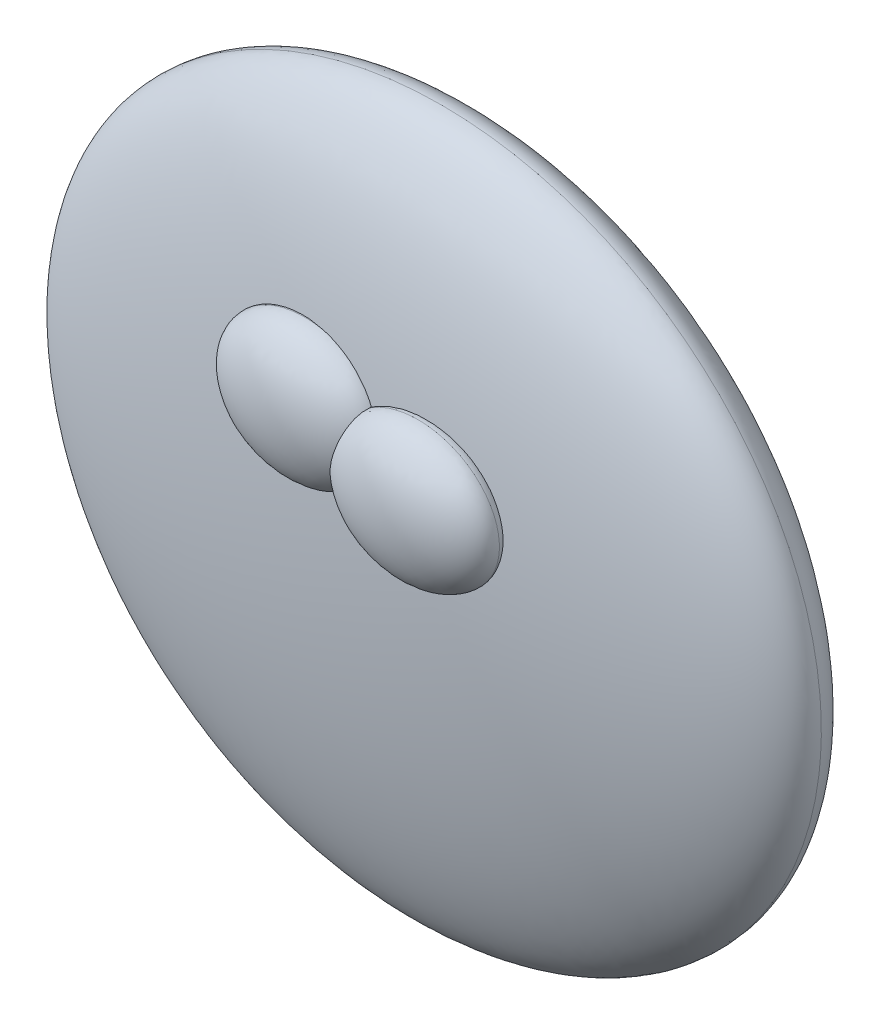
ISO-10303-21;
HEADER;
FILE_DESCRIPTION(('STEP AP214'),'2;1');
FILE_NAME('part.step','',(''),(''),'','','');
FILE_SCHEMA(('AUTOMOTIVE_DESIGN { 1 0 10303 214 1 1 1 1 }'));
ENDSEC;
DATA;
#1=APPLICATION_CONTEXT('core data for automotive mechanical design processes');
#2=APPLICATION_PROTOCOL_DEFINITION('international standard','automotive_design',2000,#1);
#3=PRODUCT_CONTEXT('',#1,'mechanical');
#4=PRODUCT('Part','Part','',(#3));
#5=PRODUCT_RELATED_PRODUCT_CATEGORY('part','',(#4));
#6=PRODUCT_DEFINITION_FORMATION('','',#4);
#7=PRODUCT_DEFINITION_CONTEXT('part definition',#1,'design');
#8=PRODUCT_DEFINITION('design','',#6,#7);
#9=PRODUCT_DEFINITION_SHAPE('','',#8);
#10=(LENGTH_UNIT() NAMED_UNIT(*) SI_UNIT(.MILLI.,.METRE.));
#11=(NAMED_UNIT(*) PLANE_ANGLE_UNIT() SI_UNIT($,.RADIAN.));
#12=(NAMED_UNIT(*) SI_UNIT($,.STERADIAN.) SOLID_ANGLE_UNIT());
#13=UNCERTAINTY_MEASURE_WITH_UNIT(LENGTH_MEASURE(1.E-05),#10,'distance_accuracy_value','');
#14=(GEOMETRIC_REPRESENTATION_CONTEXT(3) GLOBAL_UNCERTAINTY_ASSIGNED_CONTEXT((#13)) GLOBAL_UNIT_ASSIGNED_CONTEXT((#10,
#11,#12)) REPRESENTATION_CONTEXT('',''));
#15=CARTESIAN_POINT('',(0.,0.,0.));
#16=DIRECTION('',(0.,0.,1.));
#17=DIRECTION('',(1.,0.,0.));
#18=AXIS2_PLACEMENT_3D('',#15,#16,#17);
#19=CARTESIAN_POINT('',(-0.182486812125,0.03085283473532,0.11764602781));
#20=CARTESIAN_POINT('',(-0.183182416261,0.01588381094367,0.117734641001));
#21=CARTESIAN_POINT('',(-0.200799941815,0.0167024677759,0.117730916362));
#22=CARTESIAN_POINT('',(-0.218417467369,0.01752112460814,0.117727191723));
#23=CARTESIAN_POINT('',(-0.217721863233,0.03249014839979,0.117638578532));
#24=CARTESIAN_POINT('',(-0.182486812125,0.03085283473532,0.11764602781));
#25=CARTESIAN_POINT('',(-0.183181880746,0.01593368741118,0.126164249849));
#26=CARTESIAN_POINT('',(-0.2007994063,0.01675234424341,0.12616052521));
#27=CARTESIAN_POINT('',(-0.218416931854,0.01757100107564,0.126156800572));
#28=CARTESIAN_POINT('',(-0.217721863233,0.03249014839979,0.117638578532));
#29=CARTESIAN_POINT('',(-0.182486812125,0.03085283473532,0.11764602781));
#30=CARTESIAN_POINT('',(-0.182486276609,0.03090271120283,0.126075636659));
#31=CARTESIAN_POINT('',(-0.200103802163,0.03172136803506,0.12607191202));
#32=CARTESIAN_POINT('',(-0.217721327717,0.03254002486729,0.126068187381));
#33=CARTESIAN_POINT('',(-0.217721863233,0.03249014839979,0.117638578532));
#34=CARTESIAN_POINT('',(-0.182486812125,0.03085283473532,0.11764602781));
#35=CARTESIAN_POINT('',(-0.181790672473,0.04587173499448,0.125987023468));
#36=CARTESIAN_POINT('',(-0.199408198027,0.04669039182671,0.125983298829));
#37=CARTESIAN_POINT('',(-0.217025723581,0.04750904865895,0.12597957419));
#38=CARTESIAN_POINT('',(-0.217721863233,0.03249014839979,0.117638578532));
#39=CARTESIAN_POINT('',(-0.182486812125,0.03085283473532,0.11764602781));
#40=CARTESIAN_POINT('',(-0.181791207988,0.04582185852697,0.117557414619));
#41=CARTESIAN_POINT('',(-0.199408733542,0.0466405153592,0.117553689981));
#42=CARTESIAN_POINT('',(-0.217026259096,0.04745917219144,0.117549965342));
#43=CARTESIAN_POINT('',(-0.217721863233,0.03249014839979,0.117638578532));
#44=(BOUNDED_SURFACE() B_SPLINE_SURFACE(2,2,((#19,#20,#21,#22,#23),(#24,#25,#26,#27,#28),(#29,
#30,#31,#32,#33),(#34,#35,#36,#37,#38),(#39,#40,#41,#42,#43)),.UNSPECIFIED.,.F.,.F.,
.F.) B_SPLINE_SURFACE_WITH_KNOTS((3,2,3),(3,2,3),(0.,1.570796326795,3.14159265359),
(-1.570796326795,0.,1.570796326795),
.UNSPECIFIED.) GEOMETRIC_REPRESENTATION_ITEM() RATIONAL_B_SPLINE_SURFACE(((1.,0.707106781187,1.,
0.707106781187,1.),(0.707106781187,0.5,0.707106781187,0.5,0.707106781187),(1.,0.707106781187,1.,
0.707106781187,1.),(0.707106781187,0.5,0.707106781187,0.5,0.707106781187),(1.,0.707106781187,1.,
0.707106781187,1.))) REPRESENTATION_ITEM('') SURFACE());
#45=CARTESIAN_POINT('',(-0.182486812125,0.03085283473532,0.11764602781));
#46=CARTESIAN_POINT('',(-0.181791207988,0.04582185852697,0.117557414619));
#47=CARTESIAN_POINT('',(-0.199408733542,0.0466405153592,0.117553689981));
#48=CARTESIAN_POINT('',(-0.217026259096,0.04745917219144,0.117549965342));
#49=CARTESIAN_POINT('',(-0.217721863233,0.03249014839979,0.117638578532));
#50=(BOUNDED_CURVE() B_SPLINE_CURVE(2,(#45,#46,#47,#48,#49),.UNSPECIFIED.,.F.,
.F.) B_SPLINE_CURVE_WITH_KNOTS((3,2,3),(-1.570796326795,0.,1.570796326795),
.UNSPECIFIED.) CURVE() GEOMETRIC_REPRESENTATION_ITEM() RATIONAL_B_SPLINE_CURVE((1.,
0.707106781187,1.,0.707106781187,1.)) REPRESENTATION_ITEM(''));
#51=CARTESIAN_POINT('',(-0.182486812125,0.03085283473532,0.11764602781));
#52=VERTEX_POINT('',#51);
#53=CARTESIAN_POINT('',(-0.217721863233,0.03249014839979,0.117638578532));
#54=VERTEX_POINT('',#53);
#55=EDGE_CURVE('P0_E20',#52,#54,#50,.T.);
#56=CARTESIAN_POINT('',(-0.182486812125,0.03085283473532,0.11764602781));
#57=CARTESIAN_POINT('',(-0.183182416260353,0.0158838110038796,0.117734651175173));
#58=CARTESIAN_POINT('',(-0.200799941814353,0.0167024678361096,0.117730926536173));
#59=CARTESIAN_POINT('',(-0.218417467368353,0.0175211246683496,0.117727201897173));
#60=CARTESIAN_POINT('',(-0.217721863233,0.03249014839979,0.117638578532));
#61=(BOUNDED_CURVE() B_SPLINE_CURVE(2,(#56,#57,#58,#59,#60),.UNSPECIFIED.,.F.,
.F.) B_SPLINE_CURVE_WITH_KNOTS((3,2,3),(-1.570796326795,0.,1.570796326795),
.UNSPECIFIED.) CURVE() GEOMETRIC_REPRESENTATION_ITEM() RATIONAL_B_SPLINE_CURVE((0.999999500062691,
0.707106427677939,0.999999500062691,0.707106427677939,0.999999500062691)) REPRESENTATION_ITEM(''));
#62=EDGE_CURVE('P0_E11',#54,#52,#61,.F.);
#63=ORIENTED_EDGE('',*,*,#55,.T.);
#64=ORIENTED_EDGE('',*,*,#62,.T.);
#65=EDGE_LOOP('',(#63,#64));
#66=FACE_BOUND('',#65,.T.);
#67=ADVANCED_FACE('P0_F17',(#66),#44,.T.);
#68=OPEN_SHELL('',(#67));
#69=SHELL_BASED_SURFACE_MODEL('P0_B1',(#68));
#70=CARTESIAN_POINT('',(-0.298258749852,0.01326748589959,0.09838185279975));
#71=CARTESIAN_POINT('',(-0.297432878373,0.09018688834261,0.09792668217288));
#72=CARTESIAN_POINT('',(-0.213918922302,0.08929021218269,0.09792668217288));
#73=CARTESIAN_POINT('',(-0.130404966232,0.08839353602277,0.09792668217288));
#74=CARTESIAN_POINT('',(-0.131230837711,0.01147413357976,0.09838185279975));
#75=CARTESIAN_POINT('',(-0.298258749852,0.01326748589959,0.09838185279975));
#76=CARTESIAN_POINT('',(-0.297431551952,0.09031042753503,0.118806009071));
#77=CARTESIAN_POINT('',(-0.213917595882,0.08941375137512,0.118806009071));
#78=CARTESIAN_POINT('',(-0.130403639811,0.0885170752152,0.118806009071));
#79=CARTESIAN_POINT('',(-0.131230837711,0.01147413357976,0.09838185279975));
#80=CARTESIAN_POINT('',(-0.298258749852,0.01326748589959,0.09838185279975));
#81=CARTESIAN_POINT('',(-0.298257423431,0.01339102509202,0.119261179698));
#82=CARTESIAN_POINT('',(-0.214743467361,0.0124943489321,0.119261179698));
#83=CARTESIAN_POINT('',(-0.13122951129,0.01159767277219,0.119261179698));
#84=CARTESIAN_POINT('',(-0.131230837711,0.01147413357976,0.09838185279975));
#85=CARTESIAN_POINT('',(-0.298258749852,0.01326748589959,0.09838185279975));
#86=CARTESIAN_POINT('',(-0.29908329491,-0.06352837735099,0.119716350325));
#87=CARTESIAN_POINT('',(-0.215569338839,-0.06442505351091,0.119716350325));
#88=CARTESIAN_POINT('',(-0.132055382769,-0.06532172967083,0.119716350325));
#89=CARTESIAN_POINT('',(-0.131230837711,0.01147413357976,0.09838185279975));
#90=CARTESIAN_POINT('',(-0.298258749852,0.01326748589959,0.09838185279975));
#91=CARTESIAN_POINT('',(-0.299084621331,-0.06365191654342,0.09883702342662));
#92=CARTESIAN_POINT('',(-0.21557066526,-0.06454859270334,0.09883702342662));
#93=CARTESIAN_POINT('',(-0.13205670919,-0.06544526886325,0.09883702342662));
#94=CARTESIAN_POINT('',(-0.131230837711,0.01147413357976,0.09838185279975));
#95=(BOUNDED_SURFACE() B_SPLINE_SURFACE(2,2,((#70,#71,#72,#73,#74),(#75,#76,#77,#78,#79),(#80,
#81,#82,#83,#84),(#85,#86,#87,#88,#89),(#90,#91,#92,#93,#94)),.UNSPECIFIED.,.F.,.F.,
.F.) B_SPLINE_SURFACE_WITH_KNOTS((3,2,3),(3,2,3),(0.,1.570796326795,3.14159265359),
(-1.570796326795,0.,1.570796326795),
.UNSPECIFIED.) GEOMETRIC_REPRESENTATION_ITEM() RATIONAL_B_SPLINE_SURFACE(((1.,0.707106781187,1.,
0.707106781187,1.),(0.707106781187,0.5,0.707106781187,0.5,0.707106781187),(1.,0.707106781187,1.,
0.707106781187,1.),(0.707106781187,0.5,0.707106781187,0.5,0.707106781187),(1.,0.707106781187,1.,
0.707106781187,1.))) REPRESENTATION_ITEM('') SURFACE());
#96=CARTESIAN_POINT('',(-0.298258749852,0.01326748589959,0.09838185279975));
#97=CARTESIAN_POINT('',(-0.299084621331001,-0.0636519165435194,0.0988370234098183));
#98=CARTESIAN_POINT('',(-0.215570665260001,-0.0645485927034394,0.0988370234098183));
#99=CARTESIAN_POINT('',(-0.132056709190001,-0.0654452688633494,0.0988370234098183));
#100=CARTESIAN_POINT('',(-0.131230837711,0.01147413357976,0.09838185279975));
#101=(BOUNDED_CURVE() B_SPLINE_CURVE(2,(#96,#97,#98,#99,#100),.UNSPECIFIED.,.F.,
.F.) B_SPLINE_CURVE_WITH_KNOTS((3,2,3),(-1.570796326795,0.,1.570796326795),
.UNSPECIFIED.) CURVE() GEOMETRIC_REPRESENTATION_ITEM() RATIONAL_B_SPLINE_CURVE((0.99999999966668,
0.707106780951307,0.99999999966668,0.707106780951307,0.99999999966668)) REPRESENTATION_ITEM(''));
#102=CARTESIAN_POINT('',(-0.131230837711,0.01147413357976,0.09838185279975));
#103=VERTEX_POINT('',#102);
#104=CARTESIAN_POINT('',(-0.298258749852,0.01326748589959,0.09838185279975));
#105=VERTEX_POINT('',#104);
#106=EDGE_CURVE('P1_E11',#103,#105,#101,.F.);
#107=CARTESIAN_POINT('',(-0.298258749852,0.01326748589959,0.09838185279975));
#108=CARTESIAN_POINT('',(-0.297432878373,0.090186888342571,0.0979266821662818));
#109=CARTESIAN_POINT('',(-0.213918922302,0.089290212182651,0.0979266821662818));
#110=CARTESIAN_POINT('',(-0.130404966232,0.0883935360227309,0.0979266821662818));
#111=CARTESIAN_POINT('',(-0.131230837711,0.01147413357976,0.09838185279975));
#112=(BOUNDED_CURVE() B_SPLINE_CURVE(2,(#107,#108,#109,#110,#111),.UNSPECIFIED.,.F.,
.F.) B_SPLINE_CURVE_WITH_KNOTS((3,2,3),(-1.570796326795,0.,1.570796326795),
.UNSPECIFIED.) CURVE() GEOMETRIC_REPRESENTATION_ITEM() RATIONAL_B_SPLINE_CURVE((0.999999999869102,
0.707106781094441,0.999999999869102,0.707106781094441,0.999999999869102)) REPRESENTATION_ITEM(''));
#113=EDGE_CURVE('P1_E22',#105,#103,#112,.T.);
#114=ORIENTED_EDGE('',*,*,#106,.F.);
#115=ORIENTED_EDGE('',*,*,#113,.F.);
#116=EDGE_LOOP('',(#114,#115));
#117=FACE_BOUND('',#116,.T.);
#118=ADVANCED_FACE('P1_F17',(#117),#95,.T.);
#119=CARTESIAN_POINT('',(-0.298258749852,0.01326748589959,0.09838185279975));
#120=CARTESIAN_POINT('',(-0.299084621331,-0.06365191654342,0.09883702342662));
#121=CARTESIAN_POINT('',(-0.21557066526,-0.06454859270334,0.09883702342662));
#122=CARTESIAN_POINT('',(-0.13205670919,-0.06544526886325,0.09883702342662));
#123=CARTESIAN_POINT('',(-0.131230837711,0.01147413357976,0.09838185279975));
#124=CARTESIAN_POINT('',(-0.298258749852,0.01326748589959,0.09838185279975));
#125=CARTESIAN_POINT('',(-0.299085947751,-0.06377545573585,0.07795769652833));
#126=CARTESIAN_POINT('',(-0.215571991681,-0.06467213189577,0.07795769652833));
#127=CARTESIAN_POINT('',(-0.132058035611,-0.06556880805568,0.07795769652833));
#128=CARTESIAN_POINT('',(-0.131230837711,0.01147413357976,0.09838185279975));
#129=CARTESIAN_POINT('',(-0.298258749852,0.01326748589959,0.09838185279975));
#130=CARTESIAN_POINT('',(-0.298260076273,0.01314394670716,0.07750252590146));
#131=CARTESIAN_POINT('',(-0.214746120202,0.01224727054725,0.07750252590146));
#132=CARTESIAN_POINT('',(-0.131232164132,0.01135059438733,0.07750252590146));
#133=CARTESIAN_POINT('',(-0.131230837711,0.01147413357976,0.09838185279975));
#134=CARTESIAN_POINT('',(-0.298258749852,0.01326748589959,0.09838185279975));
#135=CARTESIAN_POINT('',(-0.297434204794,0.09006334915018,0.07704735527459));
#136=CARTESIAN_POINT('',(-0.213920248723,0.08916667299026,0.07704735527459));
#137=CARTESIAN_POINT('',(-0.130406292653,0.08826999683035,0.07704735527459));
#138=CARTESIAN_POINT('',(-0.131230837711,0.01147413357976,0.09838185279975));
#139=CARTESIAN_POINT('',(-0.298258749852,0.01326748589959,0.09838185279975));
#140=CARTESIAN_POINT('',(-0.297432878373,0.09018688834261,0.09792668217288));
#141=CARTESIAN_POINT('',(-0.213918922302,0.08929021218269,0.09792668217288));
#142=CARTESIAN_POINT('',(-0.130404966232,0.08839353602277,0.09792668217288));
#143=CARTESIAN_POINT('',(-0.131230837711,0.01147413357976,0.09838185279975));
#144=(BOUNDED_SURFACE() B_SPLINE_SURFACE(2,2,((#119,#120,#121,#122,#123),(#124,#125,#126,#127,
#128),(#129,#130,#131,#132,#133),(#134,#135,#136,#137,#138),(#139,#140,#141,#142,#143)),
.UNSPECIFIED.,.F.,.F.,.F.) B_SPLINE_SURFACE_WITH_KNOTS((3,2,3),(3,2,3),(3.14159265359,
4.712388980385,6.28318530718),(-1.570796326795,0.,1.570796326795),
.UNSPECIFIED.) GEOMETRIC_REPRESENTATION_ITEM() RATIONAL_B_SPLINE_SURFACE(((1.,0.707106781187,1.,
0.707106781187,1.),(0.707106781187,0.5,0.707106781187,0.5,0.707106781187),(1.,0.707106781187,1.,
0.707106781187,1.),(0.707106781187,0.5,0.707106781187,0.5,0.707106781187),(1.,0.707106781187,1.,
0.707106781187,1.))) REPRESENTATION_ITEM('') SURFACE());
#145=ORIENTED_EDGE('',*,*,#113,.T.);
#146=ORIENTED_EDGE('',*,*,#106,.T.);
#147=EDGE_LOOP('',(#145,#146));
#148=FACE_BOUND('',#147,.T.);
#149=ADVANCED_FACE('P1_F35',(#148),#144,.T.);
#150=CLOSED_SHELL('',(#118,#149));
#151=MANIFOLD_SOLID_BREP('P1_B1',#150);
#152=CARTESIAN_POINT('',(-0.182486812125,0.03085283473532,0.11764602781));
#153=CARTESIAN_POINT('',(-0.181791207988,0.04582185852697,0.117557414619));
#154=CARTESIAN_POINT('',(-0.199408733542,0.0466405153592,0.117553689981));
#155=CARTESIAN_POINT('',(-0.217026259096,0.04745917219144,0.117549965342));
#156=CARTESIAN_POINT('',(-0.217721863233,0.03249014839979,0.117638578532));
#157=CARTESIAN_POINT('',(-0.182486812125,0.03085283473532,0.11764602781));
#158=CARTESIAN_POINT('',(-0.181791743504,0.04577198205946,0.109127805771));
#159=CARTESIAN_POINT('',(-0.199409269058,0.0465906388917,0.109124081132));
#160=CARTESIAN_POINT('',(-0.217026794612,0.04740929572393,0.109120356493));
#161=CARTESIAN_POINT('',(-0.217721863233,0.03249014839979,0.117638578532));
#162=CARTESIAN_POINT('',(-0.182486812125,0.03085283473532,0.11764602781));
#163=CARTESIAN_POINT('',(-0.182487347641,0.03080295826781,0.109216418961));
#164=CARTESIAN_POINT('',(-0.200104873195,0.03162161510004,0.109212694323));
#165=CARTESIAN_POINT('',(-0.217722398749,0.03244027193228,0.109208969684));
#166=CARTESIAN_POINT('',(-0.217721863233,0.03249014839979,0.117638578532));
#167=CARTESIAN_POINT('',(-0.182486812125,0.03085283473532,0.11764602781));
#168=CARTESIAN_POINT('',(-0.183182951777,0.01583393447616,0.109305032152));
#169=CARTESIAN_POINT('',(-0.200800477331,0.01665259130839,0.109301307513));
#170=CARTESIAN_POINT('',(-0.218418002885,0.01747124814063,0.109297582874));
#171=CARTESIAN_POINT('',(-0.217721863233,0.03249014839979,0.117638578532));
#172=CARTESIAN_POINT('',(-0.182486812125,0.03085283473532,0.11764602781));
#173=CARTESIAN_POINT('',(-0.183182416261,0.01588381094367,0.117734641001));
#174=CARTESIAN_POINT('',(-0.200799941815,0.0167024677759,0.117730916362));
#175=CARTESIAN_POINT('',(-0.218417467369,0.01752112460814,0.117727191723));
#176=CARTESIAN_POINT('',(-0.217721863233,0.03249014839979,0.117638578532));
#177=(BOUNDED_SURFACE() B_SPLINE_SURFACE(2,2,((#152,#153,#154,#155,#156),(#157,#158,#159,#160,
#161),(#162,#163,#164,#165,#166),(#167,#168,#169,#170,#171),(#172,#173,#174,#175,#176)),
.UNSPECIFIED.,.F.,.F.,.F.) B_SPLINE_SURFACE_WITH_KNOTS((3,2,3),(3,2,3),(3.14159265359,
4.712388980385,6.28318530718),(-1.570796326795,0.,1.570796326795),
.UNSPECIFIED.) GEOMETRIC_REPRESENTATION_ITEM() RATIONAL_B_SPLINE_SURFACE(((1.,0.707106781187,1.,
0.707106781187,1.),(0.707106781187,0.5,0.707106781187,0.5,0.707106781187),(1.,0.707106781187,1.,
0.707106781187,1.),(0.707106781187,0.5,0.707106781187,0.5,0.707106781187),(1.,0.707106781187,1.,
0.707106781187,1.))) REPRESENTATION_ITEM('') SURFACE());
#178=CARTESIAN_POINT('',(-0.182486812125,0.03085283473532,0.11764602781));
#179=CARTESIAN_POINT('',(-0.183182416261,0.01588381094367,0.117734641001));
#180=CARTESIAN_POINT('',(-0.200799941815,0.0167024677759,0.117730916362));
#181=CARTESIAN_POINT('',(-0.218417467369,0.01752112460814,0.117727191723));
#182=CARTESIAN_POINT('',(-0.217721863233,0.03249014839979,0.117638578532));
#183=(BOUNDED_CURVE() B_SPLINE_CURVE(2,(#178,#179,#180,#181,#182),.UNSPECIFIED.,.F.,
.F.) B_SPLINE_CURVE_WITH_KNOTS((3,2,3),(-1.570796326795,0.,1.570796326795),
.UNSPECIFIED.) CURVE() GEOMETRIC_REPRESENTATION_ITEM() RATIONAL_B_SPLINE_CURVE((1.,
0.707106781187,1.,0.707106781187,1.)) REPRESENTATION_ITEM(''));
#184=CARTESIAN_POINT('',(-0.182486812125,0.03085283473532,0.11764602781));
#185=VERTEX_POINT('',#184);
#186=CARTESIAN_POINT('',(-0.217721863233,0.03249014839979,0.117638578532));
#187=VERTEX_POINT('',#186);
#188=EDGE_CURVE('P2_E20',#185,#187,#183,.T.);
#189=CARTESIAN_POINT('',(-0.182486812125,0.03085283473532,0.11764602781));
#190=CARTESIAN_POINT('',(-0.181791207988647,0.0458218584667605,0.11755740444485));
#191=CARTESIAN_POINT('',(-0.199408733542647,0.0466405152989905,0.11755367980685));
#192=CARTESIAN_POINT('',(-0.217026259096647,0.0474591721312305,0.11754995516785));
#193=CARTESIAN_POINT('',(-0.217721863233,0.03249014839979,0.117638578532));
#194=(BOUNDED_CURVE() B_SPLINE_CURVE(2,(#189,#190,#191,#192,#193),.UNSPECIFIED.,.F.,
.F.) B_SPLINE_CURVE_WITH_KNOTS((3,2,3),(-1.570796326795,0.,1.570796326795),
.UNSPECIFIED.) CURVE() GEOMETRIC_REPRESENTATION_ITEM() RATIONAL_B_SPLINE_CURVE((0.999999500063856,
0.707106427678762,0.999999500063856,0.707106427678762,0.999999500063856)) REPRESENTATION_ITEM(''));
#195=EDGE_CURVE('P2_E11',#187,#185,#194,.F.);
#196=ORIENTED_EDGE('',*,*,#188,.T.);
#197=ORIENTED_EDGE('',*,*,#195,.T.);
#198=EDGE_LOOP('',(#196,#197));
#199=FACE_BOUND('',#198,.T.);
#200=ADVANCED_FACE('P2_F17',(#199),#177,.T.);
#201=OPEN_SHELL('',(#200));
#202=SHELL_BASED_SURFACE_MODEL('P2_B1',(#201));
#203=CARTESIAN_POINT('',(-0.208867648266,0.03631411220825,0.116085739361));
#204=CARTESIAN_POINT('',(-0.209563252402,0.0213450884166,0.116174352552));
#205=CARTESIAN_POINT('',(-0.227180777956,0.02216374524884,0.116170627913));
#206=CARTESIAN_POINT('',(-0.24479830351,0.02298240208107,0.116166903274));
#207=CARTESIAN_POINT('',(-0.244102699374,0.03795142587272,0.116078290083));
#208=CARTESIAN_POINT('',(-0.208867648266,0.03631411220825,0.116085739361));
#209=CARTESIAN_POINT('',(-0.209562716887,0.02139496488411,0.1246039614));
#210=CARTESIAN_POINT('',(-0.227180242441,0.02221362171634,0.124600236761));
#211=CARTESIAN_POINT('',(-0.244797767995,0.02303227854858,0.124596512123));
#212=CARTESIAN_POINT('',(-0.244102699374,0.03795142587272,0.116078290083));
#213=CARTESIAN_POINT('',(-0.208867648266,0.03631411220825,0.116085739361));
#214=CARTESIAN_POINT('',(-0.20886711275,0.03636398867576,0.12451534821));
#215=CARTESIAN_POINT('',(-0.226484638304,0.037182645508,0.124511623571));
#216=CARTESIAN_POINT('',(-0.244102163858,0.03800130234023,0.124507898932));
#217=CARTESIAN_POINT('',(-0.244102699374,0.03795142587272,0.116078290083));
#218=CARTESIAN_POINT('',(-0.208867648266,0.03631411220825,0.116085739361));
#219=CARTESIAN_POINT('',(-0.208171508613,0.05133301246741,0.124426735019));
#220=CARTESIAN_POINT('',(-0.225789034167,0.05215166929965,0.12442301038));
#221=CARTESIAN_POINT('',(-0.243406559721,0.05297032613188,0.124419285741));
#222=CARTESIAN_POINT('',(-0.244102699374,0.03795142587272,0.116078290083));
#223=CARTESIAN_POINT('',(-0.208867648266,0.03631411220825,0.116085739361));
#224=CARTESIAN_POINT('',(-0.208172044129,0.0512831359999,0.115997126171));
#225=CARTESIAN_POINT('',(-0.225789569683,0.05210179283214,0.115993401532));
#226=CARTESIAN_POINT('',(-0.243407095237,0.05292044966437,0.115989676893));
#227=CARTESIAN_POINT('',(-0.244102699374,0.03795142587272,0.116078290083));
#228=(BOUNDED_SURFACE() B_SPLINE_SURFACE(2,2,((#203,#204,#205,#206,#207),(#208,#209,#210,#211,
#212),(#213,#214,#215,#216,#217),(#218,#219,#220,#221,#222),(#223,#224,#225,#226,#227)),
.UNSPECIFIED.,.F.,.F.,.F.) B_SPLINE_SURFACE_WITH_KNOTS((3,2,3),(3,2,3),(0.,1.570796326795,
3.14159265359),(-1.570796326795,0.,1.570796326795),
.UNSPECIFIED.) GEOMETRIC_REPRESENTATION_ITEM() RATIONAL_B_SPLINE_SURFACE(((1.,0.707106781187,1.,
0.707106781187,1.),(0.707106781187,0.5,0.707106781187,0.5,0.707106781187),(1.,0.707106781187,1.,
0.707106781187,1.),(0.707106781187,0.5,0.707106781187,0.5,0.707106781187),(1.,0.707106781187,1.,
0.707106781187,1.))) REPRESENTATION_ITEM('') SURFACE());
#229=CARTESIAN_POINT('',(-0.208867648266,0.03631411220825,0.116085739361));
#230=CARTESIAN_POINT('',(-0.208172044129,0.0512831359999,0.115997126171));
#231=CARTESIAN_POINT('',(-0.225789569683,0.05210179283214,0.115993401532));
#232=CARTESIAN_POINT('',(-0.243407095237,0.05292044966437,0.115989676893));
#233=CARTESIAN_POINT('',(-0.244102699374,0.03795142587272,0.116078290083));
#234=(BOUNDED_CURVE() B_SPLINE_CURVE(2,(#229,#230,#231,#232,#233),.UNSPECIFIED.,.F.,
.F.) B_SPLINE_CURVE_WITH_KNOTS((3,2,3),(-1.570796326795,0.,1.570796326795),
.UNSPECIFIED.) CURVE() GEOMETRIC_REPRESENTATION_ITEM() RATIONAL_B_SPLINE_CURVE((1.,
0.707106781187,1.,0.707106781187,1.)) REPRESENTATION_ITEM(''));
#235=CARTESIAN_POINT('',(-0.208867648266,0.03631411220825,0.116085739361));
#236=VERTEX_POINT('',#235);
#237=CARTESIAN_POINT('',(-0.244102699374,0.03795142587272,0.116078290083));
#238=VERTEX_POINT('',#237);
#239=EDGE_CURVE('P3_E20',#236,#238,#234,.T.);
#240=CARTESIAN_POINT('',(-0.208867648266,0.03631411220825,0.116085739361));
#241=CARTESIAN_POINT('',(-0.209563252401353,0.0213450884768096,0.116174362726167));
#242=CARTESIAN_POINT('',(-0.227180777955353,0.0221637453090496,0.116170638087167));
#243=CARTESIAN_POINT('',(-0.244798303509353,0.0229824021412796,0.116166913448167));
#244=CARTESIAN_POINT('',(-0.244102699374,0.03795142587272,0.116078290083));
#245=(BOUNDED_CURVE() B_SPLINE_CURVE(2,(#240,#241,#242,#243,#244),.UNSPECIFIED.,.F.,
.F.) B_SPLINE_CURVE_WITH_KNOTS((3,2,3),(-1.570796326795,0.,1.570796326795),
.UNSPECIFIED.) CURVE() GEOMETRIC_REPRESENTATION_ITEM() RATIONAL_B_SPLINE_CURVE((0.999999500063015,
0.707106427678167,0.999999500063015,0.707106427678167,0.999999500063015)) REPRESENTATION_ITEM(''));
#246=EDGE_CURVE('P3_E11',#238,#236,#245,.F.);
#247=ORIENTED_EDGE('',*,*,#239,.T.);
#248=ORIENTED_EDGE('',*,*,#246,.T.);
#249=EDGE_LOOP('',(#247,#248));
#250=FACE_BOUND('',#249,.T.);
#251=ADVANCED_FACE('P3_F17',(#250),#228,.T.);
#252=OPEN_SHELL('',(#251));
#253=SHELL_BASED_SURFACE_MODEL('P3_B1',(#252));
#254=CARTESIAN_POINT('',(-0.208867648266,0.03631411220825,0.116085739361));
#255=CARTESIAN_POINT('',(-0.208172044129,0.0512831359999,0.115997126171));
#256=CARTESIAN_POINT('',(-0.225789569683,0.05210179283214,0.115993401532));
#257=CARTESIAN_POINT('',(-0.243407095237,0.05292044966437,0.115989676893));
#258=CARTESIAN_POINT('',(-0.244102699374,0.03795142587272,0.116078290083));
#259=CARTESIAN_POINT('',(-0.208867648266,0.03631411220825,0.116085739361));
#260=CARTESIAN_POINT('',(-0.208172579645,0.0512332595324,0.107567517322));
#261=CARTESIAN_POINT('',(-0.225790105199,0.05205191636463,0.107563792683));
#262=CARTESIAN_POINT('',(-0.243407630753,0.05287057319686,0.107560068044));
#263=CARTESIAN_POINT('',(-0.244102699374,0.03795142587272,0.116078290083));
#264=CARTESIAN_POINT('',(-0.208867648266,0.03631411220825,0.116085739361));
#265=CARTESIAN_POINT('',(-0.208868183782,0.03626423574075,0.107656130513));
#266=CARTESIAN_POINT('',(-0.226485709336,0.03708289257298,0.107652405874));
#267=CARTESIAN_POINT('',(-0.24410323489,0.03790154940521,0.107648681235));
#268=CARTESIAN_POINT('',(-0.244102699374,0.03795142587272,0.116078290083));
#269=CARTESIAN_POINT('',(-0.208867648266,0.03631411220825,0.116085739361));
#270=CARTESIAN_POINT('',(-0.209563787918,0.02129521194909,0.107744743703));
#271=CARTESIAN_POINT('',(-0.227181313472,0.02211386878133,0.107741019064));
#272=CARTESIAN_POINT('',(-0.244798839026,0.02293252561356,0.107737294426));
#273=CARTESIAN_POINT('',(-0.244102699374,0.03795142587272,0.116078290083));
#274=CARTESIAN_POINT('',(-0.208867648266,0.03631411220825,0.116085739361));
#275=CARTESIAN_POINT('',(-0.209563252402,0.0213450884166,0.116174352552));
#276=CARTESIAN_POINT('',(-0.227180777956,0.02216374524884,0.116170627913));
#277=CARTESIAN_POINT('',(-0.24479830351,0.02298240208107,0.116166903274));
#278=CARTESIAN_POINT('',(-0.244102699374,0.03795142587272,0.116078290083));
#279=(BOUNDED_SURFACE() B_SPLINE_SURFACE(2,2,((#254,#255,#256,#257,#258),(#259,#260,#261,#262,
#263),(#264,#265,#266,#267,#268),(#269,#270,#271,#272,#273),(#274,#275,#276,#277,#278)),
.UNSPECIFIED.,.F.,.F.,.F.) B_SPLINE_SURFACE_WITH_KNOTS((3,2,3),(3,2,3),(3.14159265359,
4.712388980385,6.28318530718),(-1.570796326795,0.,1.570796326795),
.UNSPECIFIED.) GEOMETRIC_REPRESENTATION_ITEM() RATIONAL_B_SPLINE_SURFACE(((1.,0.707106781187,1.,
0.707106781187,1.),(0.707106781187,0.5,0.707106781187,0.5,0.707106781187),(1.,0.707106781187,1.,
0.707106781187,1.),(0.707106781187,0.5,0.707106781187,0.5,0.707106781187),(1.,0.707106781187,1.,
0.707106781187,1.))) REPRESENTATION_ITEM('') SURFACE());
#280=CARTESIAN_POINT('',(-0.208867648266,0.03631411220825,0.116085739361));
#281=CARTESIAN_POINT('',(-0.209563252402,0.0213450884166,0.116174352552));
#282=CARTESIAN_POINT('',(-0.227180777956,0.02216374524884,0.116170627913));
#283=CARTESIAN_POINT('',(-0.24479830351,0.02298240208107,0.116166903274));
#284=CARTESIAN_POINT('',(-0.244102699374,0.03795142587272,0.116078290083));
#285=(BOUNDED_CURVE() B_SPLINE_CURVE(2,(#280,#281,#282,#283,#284),.UNSPECIFIED.,.F.,
.F.) B_SPLINE_CURVE_WITH_KNOTS((3,2,3),(-1.570796326795,0.,1.570796326795),
.UNSPECIFIED.) CURVE() GEOMETRIC_REPRESENTATION_ITEM() RATIONAL_B_SPLINE_CURVE((1.,
0.707106781187,1.,0.707106781187,1.)) REPRESENTATION_ITEM(''));
#286=CARTESIAN_POINT('',(-0.208867648266,0.03631411220825,0.116085739361));
#287=VERTEX_POINT('',#286);
#288=CARTESIAN_POINT('',(-0.244102699374,0.03795142587272,0.116078290083));
#289=VERTEX_POINT('',#288);
#290=EDGE_CURVE('P4_E20',#287,#289,#285,.T.);
#291=CARTESIAN_POINT('',(-0.208867648266,0.03631411220825,0.116085739361));
#292=CARTESIAN_POINT('',(-0.208172044129647,0.0512831359396905,0.115997115996841));
#293=CARTESIAN_POINT('',(-0.225789569683647,0.0521017927719304,0.115993391357841));
#294=CARTESIAN_POINT('',(-0.243407095237647,0.0529204496041604,0.115989666718841));
#295=CARTESIAN_POINT('',(-0.244102699374,0.03795142587272,0.116078290083));
#296=(BOUNDED_CURVE() B_SPLINE_CURVE(2,(#291,#292,#293,#294,#295),.UNSPECIFIED.,.F.,
.F.) B_SPLINE_CURVE_WITH_KNOTS((3,2,3),(-1.570796326795,0.,1.570796326795),
.UNSPECIFIED.) CURVE() GEOMETRIC_REPRESENTATION_ITEM() RATIONAL_B_SPLINE_CURVE((0.999999500063391,
0.707106427678433,0.999999500063391,0.707106427678433,0.999999500063391)) REPRESENTATION_ITEM(''));
#297=EDGE_CURVE('P4_E11',#289,#287,#296,.F.);
#298=ORIENTED_EDGE('',*,*,#290,.T.);
#299=ORIENTED_EDGE('',*,*,#297,.T.);
#300=EDGE_LOOP('',(#298,#299));
#301=FACE_BOUND('',#300,.T.);
#302=ADVANCED_FACE('P4_F17',(#301),#279,.T.);
#303=OPEN_SHELL('',(#302));
#304=SHELL_BASED_SURFACE_MODEL('P4_B1',(#303));
#305=ADVANCED_BREP_SHAPE_REPRESENTATION('',(#18,#151),#14);
#306=MANIFOLD_SURFACE_SHAPE_REPRESENTATION('',(#18,#69,#202,#253,#304),#14);
#307=SHAPE_REPRESENTATION('',(#18),#14);
#308=SHAPE_DEFINITION_REPRESENTATION(#9,#307);
#309=SHAPE_REPRESENTATION_RELATIONSHIP('','',#307,#305);
#310=SHAPE_REPRESENTATION_RELATIONSHIP('','',#307,#306);
ENDSEC;
END-ISO-10303-21;
